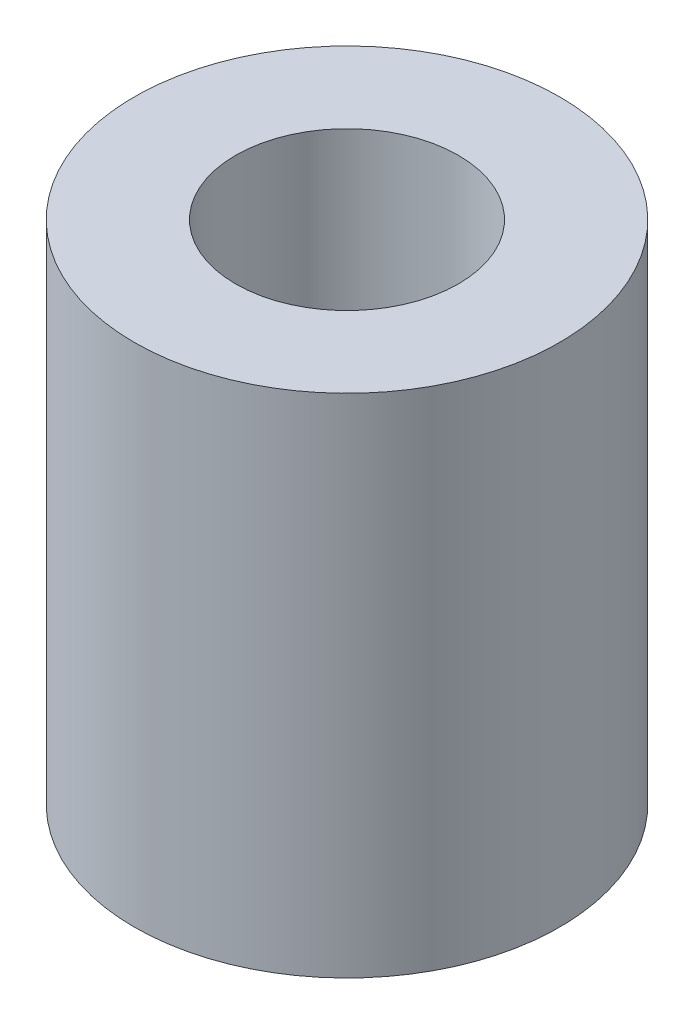
ISO-10303-21;
HEADER;
FILE_DESCRIPTION(('STEP AP214'),'2;1');
FILE_NAME('part.step','',(''),(''),'','','');
FILE_SCHEMA(('AUTOMOTIVE_DESIGN { 1 0 10303 214 1 1 1 1 }'));
ENDSEC;
DATA;
#1=APPLICATION_CONTEXT('core data for automotive mechanical design processes');
#2=APPLICATION_PROTOCOL_DEFINITION('international standard','automotive_design',2000,#1);
#3=PRODUCT_CONTEXT('',#1,'mechanical');
#4=PRODUCT('Part','Part','',(#3));
#5=PRODUCT_RELATED_PRODUCT_CATEGORY('part','',(#4));
#6=PRODUCT_DEFINITION_FORMATION('','',#4);
#7=PRODUCT_DEFINITION_CONTEXT('part definition',#1,'design');
#8=PRODUCT_DEFINITION('design','',#6,#7);
#9=PRODUCT_DEFINITION_SHAPE('','',#8);
#10=(LENGTH_UNIT() NAMED_UNIT(*) SI_UNIT(.MILLI.,.METRE.));
#11=(NAMED_UNIT(*) PLANE_ANGLE_UNIT() SI_UNIT($,.RADIAN.));
#12=(NAMED_UNIT(*) SI_UNIT($,.STERADIAN.) SOLID_ANGLE_UNIT());
#13=UNCERTAINTY_MEASURE_WITH_UNIT(LENGTH_MEASURE(1.E-05),#10,'distance_accuracy_value','');
#14=(GEOMETRIC_REPRESENTATION_CONTEXT(3) GLOBAL_UNCERTAINTY_ASSIGNED_CONTEXT((#13)) GLOBAL_UNIT_ASSIGNED_CONTEXT((#10,
#11,#12)) REPRESENTATION_CONTEXT('',''));
#15=CARTESIAN_POINT('',(0.,0.,0.));
#16=DIRECTION('',(0.,0.,1.));
#17=DIRECTION('',(1.,0.,0.));
#18=AXIS2_PLACEMENT_3D('',#15,#16,#17);
#19=CARTESIAN_POINT('',(0.,5.,0.));
#20=DIRECTION('',(0.,1.,0.));
#21=DIRECTION('',(0.,0.,1.));
#22=AXIS2_PLACEMENT_3D('',#19,#20,#21);
#23=PLANE('',#22);
#24=CARTESIAN_POINT('',(0.,5.,0.));
#25=DIRECTION('',(0.,1.,0.));
#26=DIRECTION('',(0.,0.,1.));
#27=AXIS2_PLACEMENT_3D('',#24,#25,#26);
#28=CIRCLE('',#27,2.1);
#29=CARTESIAN_POINT('',(0.,5.,2.1));
#30=VERTEX_POINT('',#29);
#31=EDGE_CURVE('E10',#30,#30,#28,.T.);
#32=ORIENTED_EDGE('',*,*,#31,.T.);
#33=EDGE_LOOP('',(#32));
#34=FACE_BOUND('',#33,.T.);
#35=CARTESIAN_POINT('',(0.,5.,0.));
#36=DIRECTION('',(0.,1.,0.));
#37=DIRECTION('',(0.,0.,1.));
#38=AXIS2_PLACEMENT_3D('',#35,#36,#37);
#39=CIRCLE('',#38,1.1);
#40=CARTESIAN_POINT('',(0.,5.,1.1));
#41=VERTEX_POINT('',#40);
#42=EDGE_CURVE('E56',#41,#41,#39,.T.);
#43=ORIENTED_EDGE('',*,*,#42,.F.);
#44=EDGE_LOOP('',(#43));
#45=FACE_BOUND('',#44,.T.);
#46=ADVANCED_FACE('F43',(#34,#45),#23,.T.);
#47=CARTESIAN_POINT('',(0.,0.,0.));
#48=DIRECTION('',(0.,1.,0.));
#49=DIRECTION('',(0.,0.,1.));
#50=AXIS2_PLACEMENT_3D('',#47,#48,#49);
#51=PLANE('',#50);
#52=CARTESIAN_POINT('',(0.,0.,0.));
#53=DIRECTION('',(0.,1.,0.));
#54=DIRECTION('',(0.,0.,1.));
#55=AXIS2_PLACEMENT_3D('',#52,#53,#54);
#56=CIRCLE('',#55,2.1);
#57=CARTESIAN_POINT('',(0.,0.,2.1));
#58=VERTEX_POINT('',#57);
#59=EDGE_CURVE('E47',#58,#58,#56,.T.);
#60=ORIENTED_EDGE('',*,*,#59,.F.);
#61=EDGE_LOOP('',(#60));
#62=FACE_BOUND('',#61,.T.);
#63=CARTESIAN_POINT('',(0.,0.,0.));
#64=DIRECTION('',(0.,1.,0.));
#65=DIRECTION('',(0.,0.,1.));
#66=AXIS2_PLACEMENT_3D('',#63,#64,#65);
#67=CIRCLE('',#66,1.1);
#68=CARTESIAN_POINT('',(0.,0.,1.1));
#69=VERTEX_POINT('',#68);
#70=EDGE_CURVE('E58',#69,#69,#67,.T.);
#71=ORIENTED_EDGE('',*,*,#70,.T.);
#72=EDGE_LOOP('',(#71));
#73=FACE_BOUND('',#72,.T.);
#74=ADVANCED_FACE('F70',(#62,#73),#51,.F.);
#75=CARTESIAN_POINT('',(0.,5.,0.));
#76=DIRECTION('',(0.,-1.,0.));
#77=DIRECTION('',(0.,0.,-1.));
#78=AXIS2_PLACEMENT_3D('',#75,#76,#77);
#79=CYLINDRICAL_SURFACE('',#78,2.1);
#80=ORIENTED_EDGE('',*,*,#31,.F.);
#81=EDGE_LOOP('',(#80));
#82=FACE_BOUND('',#81,.T.);
#83=ORIENTED_EDGE('',*,*,#59,.T.);
#84=EDGE_LOOP('',(#83));
#85=FACE_BOUND('',#84,.T.);
#86=ADVANCED_FACE('F45',(#82,#85),#79,.T.);
#87=CARTESIAN_POINT('',(0.,5.,0.));
#88=DIRECTION('',(0.,-1.,0.));
#89=DIRECTION('',(0.,0.,-1.));
#90=AXIS2_PLACEMENT_3D('',#87,#88,#89);
#91=CYLINDRICAL_SURFACE('',#90,1.1);
#92=ORIENTED_EDGE('',*,*,#42,.T.);
#93=EDGE_LOOP('',(#92));
#94=FACE_BOUND('',#93,.T.);
#95=ORIENTED_EDGE('',*,*,#70,.F.);
#96=EDGE_LOOP('',(#95));
#97=FACE_BOUND('',#96,.T.);
#98=ADVANCED_FACE('F66',(#94,#97),#91,.F.);
#99=CLOSED_SHELL('',(#46,#74,#86,#98));
#100=MANIFOLD_SOLID_BREP('B2',#99);
#101=ADVANCED_BREP_SHAPE_REPRESENTATION('',(#18,#100),#14);
#102=SHAPE_DEFINITION_REPRESENTATION(#9,#101);
ENDSEC;
END-ISO-10303-21;
